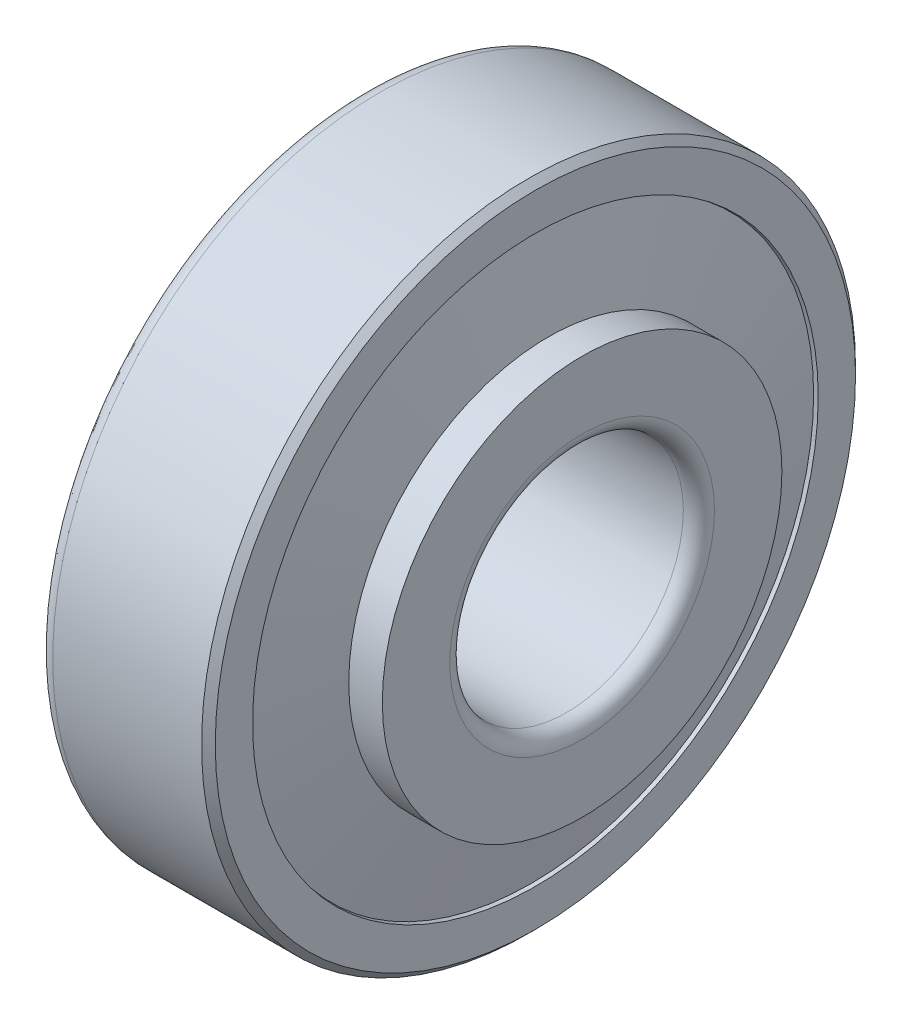
ISO-10303-21;
HEADER;
FILE_DESCRIPTION(('STEP AP214'),'2;1');
FILE_NAME('part.step','',(''),(''),'','','');
FILE_SCHEMA(('AUTOMOTIVE_DESIGN { 1 0 10303 214 1 1 1 1 }'));
ENDSEC;
DATA;
#1=APPLICATION_CONTEXT('core data for automotive mechanical design processes');
#2=APPLICATION_PROTOCOL_DEFINITION('international standard','automotive_design',2000,#1);
#3=PRODUCT_CONTEXT('',#1,'mechanical');
#4=PRODUCT('Part','Part','',(#3));
#5=PRODUCT_RELATED_PRODUCT_CATEGORY('part','',(#4));
#6=PRODUCT_DEFINITION_FORMATION('','',#4);
#7=PRODUCT_DEFINITION_CONTEXT('part definition',#1,'design');
#8=PRODUCT_DEFINITION('design','',#6,#7);
#9=PRODUCT_DEFINITION_SHAPE('','',#8);
#10=(LENGTH_UNIT() NAMED_UNIT(*) SI_UNIT(.MILLI.,.METRE.));
#11=(NAMED_UNIT(*) PLANE_ANGLE_UNIT() SI_UNIT($,.RADIAN.));
#12=(NAMED_UNIT(*) SI_UNIT($,.STERADIAN.) SOLID_ANGLE_UNIT());
#13=UNCERTAINTY_MEASURE_WITH_UNIT(LENGTH_MEASURE(1.E-05),#10,'distance_accuracy_value','');
#14=(GEOMETRIC_REPRESENTATION_CONTEXT(3) GLOBAL_UNCERTAINTY_ASSIGNED_CONTEXT((#13)) GLOBAL_UNIT_ASSIGNED_CONTEXT((#10,
#11,#12)) REPRESENTATION_CONTEXT('',''));
#15=CARTESIAN_POINT('',(0.,0.,0.));
#16=DIRECTION('',(0.,0.,1.));
#17=DIRECTION('',(1.,0.,0.));
#18=AXIS2_PLACEMENT_3D('',#15,#16,#17);
#19=CARTESIAN_POINT('',(-14.,0.,0.));
#20=DIRECTION('',(1.,0.,0.));
#21=DIRECTION('',(0.,0.,-1.));
#22=AXIS2_PLACEMENT_3D('',#19,#20,#21);
#23=CONICAL_SURFACE('',#22,16.136,0.182386906833402);
#24=CARTESIAN_POINT('',(-12.9854447003319,0.,0.));
#25=DIRECTION('',(-1.,0.,0.));
#26=DIRECTION('',(0.,0.,1.));
#27=AXIS2_PLACEMENT_3D('',#24,#25,#26);
#28=CIRCLE('',#27,16.3231210787731);
#29=CARTESIAN_POINT('',(-12.9854447003319,0.,16.3231210787731));
#30=VERTEX_POINT('',#29);
#31=EDGE_CURVE('E43',#30,#30,#28,.T.);
#32=ORIENTED_EDGE('',*,*,#31,.F.);
#33=EDGE_LOOP('',(#32));
#34=FACE_BOUND('',#33,.T.);
#35=CARTESIAN_POINT('',(-14.,0.,0.));
#36=DIRECTION('',(1.,0.,0.));
#37=DIRECTION('',(0.,0.,-1.));
#38=AXIS2_PLACEMENT_3D('',#35,#36,#37);
#39=CIRCLE('',#38,16.136);
#40=CARTESIAN_POINT('',(-14.,0.,-16.136));
#41=VERTEX_POINT('',#40);
#42=EDGE_CURVE('E55',#41,#41,#39,.T.);
#43=ORIENTED_EDGE('',*,*,#42,.F.);
#44=EDGE_LOOP('',(#43));
#45=FACE_BOUND('',#44,.T.);
#46=ADVANCED_FACE('F32',(#34,#45),#23,.F.);
#47=CARTESIAN_POINT('',(-2.99999999999999,20.56,0.));
#48=DIRECTION('',(1.,0.,0.));
#49=DIRECTION('',(0.,0.,-1.));
#50=AXIS2_PLACEMENT_3D('',#47,#48,#49);
#51=PLANE('',#50);
#52=CARTESIAN_POINT('',(-2.99999999999997,0.,0.));
#53=DIRECTION('',(1.,0.,0.));
#54=DIRECTION('',(0.,0.,-1.));
#55=AXIS2_PLACEMENT_3D('',#52,#53,#54);
#56=CIRCLE('',#55,20.56);
#57=CARTESIAN_POINT('',(-2.99999999999997,0.,-20.56));
#58=VERTEX_POINT('',#57);
#59=EDGE_CURVE('E67',#58,#58,#56,.T.);
#60=ORIENTED_EDGE('',*,*,#59,.T.);
#61=EDGE_LOOP('',(#60));
#62=FACE_BOUND('',#61,.T.);
#63=CARTESIAN_POINT('',(-3.,0.,0.));
#64=DIRECTION('',(1.,0.,0.));
#65=DIRECTION('',(0.,0.,-1.));
#66=AXIS2_PLACEMENT_3D('',#63,#64,#65);
#67=CIRCLE('',#66,18.1648020447751);
#68=CARTESIAN_POINT('',(-3.,0.,-18.1648020447751));
#69=VERTEX_POINT('',#68);
#70=EDGE_CURVE('E52',#69,#69,#67,.T.);
#71=ORIENTED_EDGE('',*,*,#70,.F.);
#72=EDGE_LOOP('',(#71));
#73=FACE_BOUND('',#72,.T.);
#74=ADVANCED_FACE('F34',(#62,#73),#51,.T.);
#75=CARTESIAN_POINT('',(-3.24965042024862,0.,0.));
#76=DIRECTION('',(-1.,0.,0.));
#77=DIRECTION('',(0.,0.,1.));
#78=AXIS2_PLACEMENT_3D('',#75,#76,#77);
#79=CIRCLE('',#78,18.118757382677);
#80=CARTESIAN_POINT('',(-3.24965042024862,0.,18.118757382677));
#81=VERTEX_POINT('',#80);
#82=EDGE_CURVE('E47',#81,#81,#79,.F.);
#83=ORIENTED_EDGE('',*,*,#82,.F.);
#84=EDGE_LOOP('',(#83));
#85=FACE_BOUND('',#84,.T.);
#86=ORIENTED_EDGE('',*,*,#70,.T.);
#87=EDGE_LOOP('',(#86));
#88=FACE_BOUND('',#87,.T.);
#89=ADVANCED_FACE('F120',(#85,#88),#23,.F.);
#90=CARTESIAN_POINT('',(-14.,16.136,0.));
#91=DIRECTION('',(-1.,0.,0.));
#92=DIRECTION('',(0.,0.,1.));
#93=AXIS2_PLACEMENT_3D('',#90,#91,#92);
#94=PLANE('',#93);
#95=ORIENTED_EDGE('',*,*,#42,.T.);
#96=EDGE_LOOP('',(#95));
#97=FACE_BOUND('',#96,.T.);
#98=CARTESIAN_POINT('',(-14.,0.,0.));
#99=DIRECTION('',(1.,0.,0.));
#100=DIRECTION('',(0.,0.,-1.));
#101=AXIS2_PLACEMENT_3D('',#98,#99,#100);
#102=CIRCLE('',#101,20.);
#103=CARTESIAN_POINT('',(-14.,0.,-20.));
#104=VERTEX_POINT('',#103);
#105=EDGE_CURVE('E58',#104,#104,#102,.T.);
#106=ORIENTED_EDGE('',*,*,#105,.F.);
#107=EDGE_LOOP('',(#106));
#108=FACE_BOUND('',#107,.T.);
#109=ADVANCED_FACE('F129',(#97,#108),#94,.T.);
#110=CARTESIAN_POINT('',(-13.,0.,0.));
#111=DIRECTION('',(1.,0.,0.));
#112=DIRECTION('',(0.,0.,-1.));
#113=AXIS2_PLACEMENT_3D('',#110,#111,#112);
#114=TOROIDAL_SURFACE('',#113,20.,1.);
#115=ORIENTED_EDGE('',*,*,#105,.T.);
#116=EDGE_LOOP('',(#115));
#117=FACE_BOUND('',#116,.T.);
#118=CARTESIAN_POINT('',(-13.,0.,0.));
#119=DIRECTION('',(1.,0.,0.));
#120=DIRECTION('',(0.,0.,-1.));
#121=AXIS2_PLACEMENT_3D('',#118,#119,#120);
#122=CIRCLE('',#121,21.);
#123=CARTESIAN_POINT('',(-13.,0.,-21.));
#124=VERTEX_POINT('',#123);
#125=EDGE_CURVE('E61',#124,#124,#122,.T.);
#126=ORIENTED_EDGE('',*,*,#125,.F.);
#127=EDGE_LOOP('',(#126));
#128=FACE_BOUND('',#127,.T.);
#129=ADVANCED_FACE('F134',(#117,#128),#114,.T.);
#130=CARTESIAN_POINT('',(-42.5,0.,0.));
#131=DIRECTION('',(1.,0.,0.));
#132=DIRECTION('',(0.,0.,-1.));
#133=AXIS2_PLACEMENT_3D('',#130,#131,#132);
#134=CYLINDRICAL_SURFACE('',#133,21.);
#135=ORIENTED_EDGE('',*,*,#125,.T.);
#136=EDGE_LOOP('',(#135));
#137=FACE_BOUND('',#136,.T.);
#138=CARTESIAN_POINT('',(-3.44000000000001,0.,0.));
#139=DIRECTION('',(1.,0.,0.));
#140=DIRECTION('',(0.,0.,-1.));
#141=AXIS2_PLACEMENT_3D('',#138,#139,#140);
#142=CIRCLE('',#141,21.);
#143=CARTESIAN_POINT('',(-3.44000000000001,0.,-21.));
#144=VERTEX_POINT('',#143);
#145=EDGE_CURVE('E64',#144,#144,#142,.T.);
#146=ORIENTED_EDGE('',*,*,#145,.F.);
#147=EDGE_LOOP('',(#146));
#148=FACE_BOUND('',#147,.T.);
#149=ADVANCED_FACE('F156',(#137,#148),#134,.T.);
#150=CARTESIAN_POINT('',(-2.99999999999997,0.,0.));
#151=DIRECTION('',(-1.,0.,0.));
#152=DIRECTION('',(0.,0.,1.));
#153=AXIS2_PLACEMENT_3D('',#150,#151,#152);
#154=CONICAL_SURFACE('',#153,20.56,0.785398163397413);
#155=ORIENTED_EDGE('',*,*,#145,.T.);
#156=EDGE_LOOP('',(#155));
#157=FACE_BOUND('',#156,.T.);
#158=ORIENTED_EDGE('',*,*,#59,.F.);
#159=EDGE_LOOP('',(#158));
#160=FACE_BOUND('',#159,.T.);
#161=ADVANCED_FACE('F150',(#157,#160),#154,.T.);
#162=CARTESIAN_POINT('',(-13.,0.,0.));
#163=DIRECTION('',(-1.,0.,0.));
#164=DIRECTION('',(0.,0.,1.));
#165=AXIS2_PLACEMENT_3D('',#162,#163,#164);
#166=CONICAL_SURFACE('',#165,16.4020387320561,1.3884094199615);
#167=CARTESIAN_POINT('',(-11.9541548699349,0.,0.));
#168=DIRECTION('',(-1.,0.,0.));
#169=DIRECTION('',(0.,0.,1.));
#170=AXIS2_PLACEMENT_3D('',#167,#168,#169);
#171=CIRCLE('',#170,10.7315513326844);
#172=CARTESIAN_POINT('',(-11.9541548699349,0.,10.7315513326844));
#173=VERTEX_POINT('',#172);
#174=EDGE_CURVE('E10',#173,#173,#171,.T.);
#175=ORIENTED_EDGE('',*,*,#174,.F.);
#176=EDGE_LOOP('',(#175));
#177=FACE_BOUND('',#176,.T.);
#178=ORIENTED_EDGE('',*,*,#31,.T.);
#179=EDGE_LOOP('',(#178));
#180=FACE_BOUND('',#179,.T.);
#181=ADVANCED_FACE('F144',(#177,#180),#166,.F.);
#182=CARTESIAN_POINT('',(-11.898132268059,0.,0.));
#183=DIRECTION('',(1.,0.,0.));
#184=DIRECTION('',(0.,0.,-1.));
#185=AXIS2_PLACEMENT_3D('',#182,#183,#184);
#186=CONICAL_SURFACE('',#185,10.4278013329141,0.182386906833398);
#187=CARTESIAN_POINT('',(-11.8928041755669,0.,0.));
#188=DIRECTION('',(-1.,0.,0.));
#189=DIRECTION('',(0.,0.,1.));
#190=AXIS2_PLACEMENT_3D('',#187,#188,#189);
#191=CIRCLE('',#190,10.4287840279089);
#192=CARTESIAN_POINT('',(-11.8928041755669,0.,10.4287840279089));
#193=VERTEX_POINT('',#192);
#194=EDGE_CURVE('E39',#193,#193,#191,.F.);
#195=ORIENTED_EDGE('',*,*,#194,.F.);
#196=EDGE_LOOP('',(#195));
#197=FACE_BOUND('',#196,.T.);
#198=CARTESIAN_POINT('',(-2.16233798797569,0.,0.));
#199=DIRECTION('',(1.,0.,0.));
#200=DIRECTION('',(0.,0.,-1.));
#201=AXIS2_PLACEMENT_3D('',#198,#199,#200);
#202=CIRCLE('',#201,12.223437636818);
#203=CARTESIAN_POINT('',(-2.16233798797569,0.,-12.223437636818));
#204=VERTEX_POINT('',#203);
#205=EDGE_CURVE('E70',#204,#204,#202,.T.);
#206=ORIENTED_EDGE('',*,*,#205,.T.);
#207=EDGE_LOOP('',(#206));
#208=FACE_BOUND('',#207,.T.);
#209=ADVANCED_FACE('F115',(#197,#208),#186,.F.);
#210=CARTESIAN_POINT('',(-2.16233798797569,0.,0.));
#211=DIRECTION('',(-1.,0.,0.));
#212=DIRECTION('',(0.,0.,1.));
#213=AXIS2_PLACEMENT_3D('',#210,#211,#212);
#214=CONICAL_SURFACE('',#213,12.223437636818,1.3884094199615);
#215=ORIENTED_EDGE('',*,*,#82,.T.);
#216=EDGE_LOOP('',(#215));
#217=FACE_BOUND('',#216,.T.);
#218=ORIENTED_EDGE('',*,*,#205,.F.);
#219=EDGE_LOOP('',(#218));
#220=FACE_BOUND('',#219,.T.);
#221=ADVANCED_FACE('F107',(#217,#220),#214,.T.);
#222=CARTESIAN_POINT('',(-11.8926229306505,0.,0.));
#223=DIRECTION('',(-1.,0.,0.));
#224=DIRECTION('',(0.,0.,1.));
#225=AXIS2_PLACEMENT_3D('',#222,#223,#224);
#226=CONICAL_SURFACE('',#225,10.4278013326844,1.38840941996149);
#227=ORIENTED_EDGE('',*,*,#194,.T.);
#228=EDGE_LOOP('',(#227));
#229=FACE_BOUND('',#228,.T.);
#230=CARTESIAN_POINT('',(-11.8926229306505,0.,0.));
#231=DIRECTION('',(1.,0.,0.));
#232=DIRECTION('',(0.,0.,-1.));
#233=AXIS2_PLACEMENT_3D('',#230,#231,#232);
#234=CIRCLE('',#233,10.4278013326844);
#235=CARTESIAN_POINT('',(-11.8926229306505,0.,-10.4278013326844));
#236=VERTEX_POINT('',#235);
#237=EDGE_CURVE('E97',#236,#236,#234,.T.);
#238=ORIENTED_EDGE('',*,*,#237,.F.);
#239=EDGE_LOOP('',(#238));
#240=FACE_BOUND('',#239,.T.);
#241=ADVANCED_FACE('F104',(#229,#240),#226,.T.);
#242=CARTESIAN_POINT('',(-42.5,0.,0.));
#243=DIRECTION('',(1.,0.,0.));
#244=DIRECTION('',(0.,0.,-1.));
#245=AXIS2_PLACEMENT_3D('',#242,#243,#244);
#246=CYLINDRICAL_SURFACE('',#245,10.7315513326844);
#247=ORIENTED_EDGE('',*,*,#174,.T.);
#248=EDGE_LOOP('',(#247));
#249=FACE_BOUND('',#248,.T.);
#250=CARTESIAN_POINT('',(-13.,0.,0.));
#251=DIRECTION('',(1.,0.,0.));
#252=DIRECTION('',(0.,0.,-1.));
#253=AXIS2_PLACEMENT_3D('',#250,#251,#252);
#254=CIRCLE('',#253,10.7315513326844);
#255=CARTESIAN_POINT('',(-13.,0.,-10.7315513326844));
#256=VERTEX_POINT('',#255);
#257=EDGE_CURVE('E73',#256,#256,#254,.T.);
#258=ORIENTED_EDGE('',*,*,#257,.T.);
#259=EDGE_LOOP('',(#258));
#260=FACE_BOUND('',#259,.T.);
#261=ADVANCED_FACE('F106',(#249,#260),#246,.T.);
#262=CARTESIAN_POINT('',(-13.,10.7315513326844,0.));
#263=DIRECTION('',(-1.,0.,0.));
#264=DIRECTION('',(0.,0.,1.));
#265=AXIS2_PLACEMENT_3D('',#262,#263,#264);
#266=PLANE('',#265);
#267=CARTESIAN_POINT('',(-13.,0.,0.));
#268=DIRECTION('',(1.,0.,0.));
#269=DIRECTION('',(0.,0.,-1.));
#270=AXIS2_PLACEMENT_3D('',#267,#268,#269);
#271=CIRCLE('',#270,7.94);
#272=CARTESIAN_POINT('',(-13.,0.,-7.94));
#273=VERTEX_POINT('',#272);
#274=EDGE_CURVE('E76',#273,#273,#271,.T.);
#275=ORIENTED_EDGE('',*,*,#274,.T.);
#276=EDGE_LOOP('',(#275));
#277=FACE_BOUND('',#276,.T.);
#278=ORIENTED_EDGE('',*,*,#257,.F.);
#279=EDGE_LOOP('',(#278));
#280=FACE_BOUND('',#279,.T.);
#281=ADVANCED_FACE('F113',(#277,#280),#266,.T.);
#282=CARTESIAN_POINT('',(-13.,0.,0.));
#283=DIRECTION('',(-1.,0.,0.));
#284=DIRECTION('',(0.,0.,1.));
#285=AXIS2_PLACEMENT_3D('',#282,#283,#284);
#286=CONICAL_SURFACE('',#285,7.94,0.785398163397448);
#287=CARTESIAN_POINT('',(-12.56,0.,0.));
#288=DIRECTION('',(1.,0.,0.));
#289=DIRECTION('',(0.,0.,-1.));
#290=AXIS2_PLACEMENT_3D('',#287,#288,#289);
#291=CIRCLE('',#290,7.50000000000001);
#292=CARTESIAN_POINT('',(-12.56,0.,-7.50000000000001));
#293=VERTEX_POINT('',#292);
#294=EDGE_CURVE('E79',#293,#293,#291,.T.);
#295=ORIENTED_EDGE('',*,*,#294,.T.);
#296=EDGE_LOOP('',(#295));
#297=FACE_BOUND('',#296,.T.);
#298=ORIENTED_EDGE('',*,*,#274,.F.);
#299=EDGE_LOOP('',(#298));
#300=FACE_BOUND('',#299,.T.);
#301=ADVANCED_FACE('F214',(#297,#300),#286,.F.);
#302=CARTESIAN_POINT('',(-42.5,0.,0.));
#303=DIRECTION('',(1.,0.,0.));
#304=DIRECTION('',(0.,0.,-1.));
#305=AXIS2_PLACEMENT_3D('',#302,#303,#304);
#306=CYLINDRICAL_SURFACE('',#305,7.50000000000001);
#307=CARTESIAN_POINT('',(-1.,0.,0.));
#308=DIRECTION('',(1.,0.,0.));
#309=DIRECTION('',(0.,0.,-1.));
#310=AXIS2_PLACEMENT_3D('',#307,#308,#309);
#311=CIRCLE('',#310,7.50000000000001);
#312=CARTESIAN_POINT('',(-1.,0.,-7.50000000000001));
#313=VERTEX_POINT('',#312);
#314=EDGE_CURVE('E82',#313,#313,#311,.T.);
#315=ORIENTED_EDGE('',*,*,#314,.T.);
#316=EDGE_LOOP('',(#315));
#317=FACE_BOUND('',#316,.T.);
#318=ORIENTED_EDGE('',*,*,#294,.F.);
#319=EDGE_LOOP('',(#318));
#320=FACE_BOUND('',#319,.T.);
#321=ADVANCED_FACE('F224',(#317,#320),#306,.F.);
#322=CARTESIAN_POINT('',(-1.,0.,0.));
#323=DIRECTION('',(1.,0.,0.));
#324=DIRECTION('',(0.,0.,-1.));
#325=AXIS2_PLACEMENT_3D('',#322,#323,#324);
#326=TOROIDAL_SURFACE('',#325,8.50000000000001,1.);
#327=CARTESIAN_POINT('',(0.,0.,0.));
#328=DIRECTION('',(1.,0.,0.));
#329=DIRECTION('',(0.,0.,-1.));
#330=AXIS2_PLACEMENT_3D('',#327,#328,#329);
#331=CIRCLE('',#330,8.50000000000001);
#332=CARTESIAN_POINT('',(0.,0.,-8.50000000000001));
#333=VERTEX_POINT('',#332);
#334=EDGE_CURVE('E85',#333,#333,#331,.T.);
#335=ORIENTED_EDGE('',*,*,#334,.T.);
#336=EDGE_LOOP('',(#335));
#337=FACE_BOUND('',#336,.T.);
#338=ORIENTED_EDGE('',*,*,#314,.F.);
#339=EDGE_LOOP('',(#338));
#340=FACE_BOUND('',#339,.T.);
#341=ADVANCED_FACE('F234',(#337,#340),#326,.T.);
#342=CARTESIAN_POINT('',(0.,8.50000000000001,0.));
#343=DIRECTION('',(1.,0.,0.));
#344=DIRECTION('',(0.,0.,-1.));
#345=AXIS2_PLACEMENT_3D('',#342,#343,#344);
#346=PLANE('',#345);
#347=CARTESIAN_POINT('',(0.,0.,0.));
#348=DIRECTION('',(1.,0.,0.));
#349=DIRECTION('',(0.,0.,-1.));
#350=AXIS2_PLACEMENT_3D('',#347,#348,#349);
#351=CIRCLE('',#350,12.8309376365884);
#352=CARTESIAN_POINT('',(0.,0.,-12.8309376365884));
#353=VERTEX_POINT('',#352);
#354=EDGE_CURVE('E88',#353,#353,#351,.T.);
#355=ORIENTED_EDGE('',*,*,#354,.T.);
#356=EDGE_LOOP('',(#355));
#357=FACE_BOUND('',#356,.T.);
#358=ORIENTED_EDGE('',*,*,#334,.F.);
#359=EDGE_LOOP('',(#358));
#360=FACE_BOUND('',#359,.T.);
#361=ADVANCED_FACE('F244',(#357,#360),#346,.T.);
#362=CARTESIAN_POINT('',(-42.5,0.,0.));
#363=DIRECTION('',(1.,0.,0.));
#364=DIRECTION('',(0.,0.,-1.));
#365=AXIS2_PLACEMENT_3D('',#362,#363,#364);
#366=CYLINDRICAL_SURFACE('',#365,12.8309376365884);
#367=CARTESIAN_POINT('',(-2.15682865056724,0.,0.));
#368=DIRECTION('',(1.,0.,0.));
#369=DIRECTION('',(0.,0.,-1.));
#370=AXIS2_PLACEMENT_3D('',#367,#368,#369);
#371=CIRCLE('',#370,12.8309376365884);
#372=CARTESIAN_POINT('',(-2.15682865056724,0.,-12.8309376365884));
#373=VERTEX_POINT('',#372);
#374=EDGE_CURVE('E91',#373,#373,#371,.T.);
#375=ORIENTED_EDGE('',*,*,#374,.T.);
#376=EDGE_LOOP('',(#375));
#377=FACE_BOUND('',#376,.T.);
#378=ORIENTED_EDGE('',*,*,#354,.F.);
#379=EDGE_LOOP('',(#378));
#380=FACE_BOUND('',#379,.T.);
#381=ADVANCED_FACE('F254',(#377,#380),#366,.T.);
#382=CARTESIAN_POINT('',(-2.15682865056724,12.8309376365884,0.));
#383=DIRECTION('',(-1.,0.,0.));
#384=DIRECTION('',(0.,0.,1.));
#385=AXIS2_PLACEMENT_3D('',#382,#383,#384);
#386=PLANE('',#385);
#387=CARTESIAN_POINT('',(-2.15682865056724,0.,0.));
#388=DIRECTION('',(1.,0.,0.));
#389=DIRECTION('',(0.,0.,-1.));
#390=AXIS2_PLACEMENT_3D('',#387,#388,#389);
#391=CIRCLE('',#390,12.2234376365883);
#392=CARTESIAN_POINT('',(-2.15682865056724,0.,-12.2234376365883));
#393=VERTEX_POINT('',#392);
#394=EDGE_CURVE('E94',#393,#393,#391,.T.);
#395=ORIENTED_EDGE('',*,*,#394,.T.);
#396=EDGE_LOOP('',(#395));
#397=FACE_BOUND('',#396,.T.);
#398=ORIENTED_EDGE('',*,*,#374,.F.);
#399=EDGE_LOOP('',(#398));
#400=FACE_BOUND('',#399,.T.);
#401=ADVANCED_FACE('F264',(#397,#400),#386,.T.);
#402=CARTESIAN_POINT('',(-2.15682865056724,0.,0.));
#403=DIRECTION('',(1.,0.,0.));
#404=DIRECTION('',(0.,0.,-1.));
#405=AXIS2_PLACEMENT_3D('',#402,#403,#404);
#406=CONICAL_SURFACE('',#405,12.2234376365883,0.182386906833401);
#407=ORIENTED_EDGE('',*,*,#237,.T.);
#408=EDGE_LOOP('',(#407));
#409=FACE_BOUND('',#408,.T.);
#410=ORIENTED_EDGE('',*,*,#394,.F.);
#411=EDGE_LOOP('',(#410));
#412=FACE_BOUND('',#411,.T.);
#413=ADVANCED_FACE('F101',(#409,#412),#406,.T.);
#414=CLOSED_SHELL('',(#46,#74,#89,#109,#129,#149,#161,#181,#209,#221,#241,#261,#281,#301,#321,
#341,#361,#381,#401,#413));
#415=MANIFOLD_SOLID_BREP('B2',#414);
#416=ADVANCED_BREP_SHAPE_REPRESENTATION('',(#18,#415),#14);
#417=SHAPE_DEFINITION_REPRESENTATION(#9,#416);
ENDSEC;
END-ISO-10303-21;
